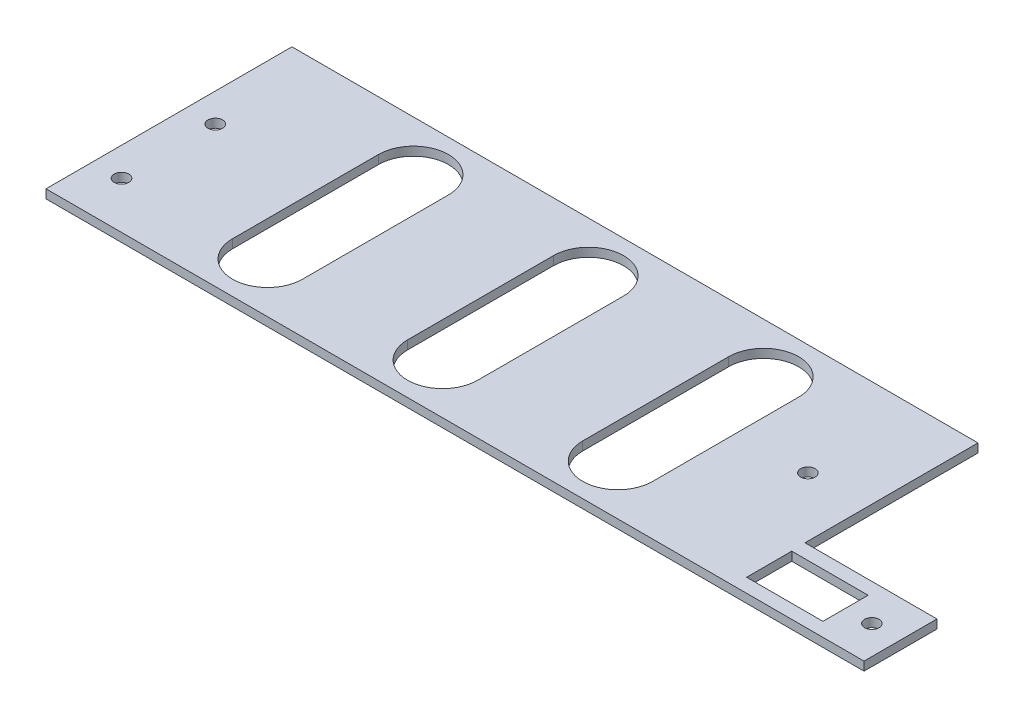
ISO-10303-21;
HEADER;
FILE_DESCRIPTION(('STEP AP214'),'2;1');
FILE_NAME('part.step','',(''),(''),'','','');
FILE_SCHEMA(('AUTOMOTIVE_DESIGN { 1 0 10303 214 1 1 1 1 }'));
ENDSEC;
DATA;
#1=APPLICATION_CONTEXT('core data for automotive mechanical design processes');
#2=APPLICATION_PROTOCOL_DEFINITION('international standard','automotive_design',2000,#1);
#3=PRODUCT_CONTEXT('',#1,'mechanical');
#4=PRODUCT('Part','Part','',(#3));
#5=PRODUCT_RELATED_PRODUCT_CATEGORY('part','',(#4));
#6=PRODUCT_DEFINITION_FORMATION('','',#4);
#7=PRODUCT_DEFINITION_CONTEXT('part definition',#1,'design');
#8=PRODUCT_DEFINITION('design','',#6,#7);
#9=PRODUCT_DEFINITION_SHAPE('','',#8);
#10=(LENGTH_UNIT() NAMED_UNIT(*) SI_UNIT(.MILLI.,.METRE.));
#11=(NAMED_UNIT(*) PLANE_ANGLE_UNIT() SI_UNIT($,.RADIAN.));
#12=(NAMED_UNIT(*) SI_UNIT($,.STERADIAN.) SOLID_ANGLE_UNIT());
#13=UNCERTAINTY_MEASURE_WITH_UNIT(LENGTH_MEASURE(1.E-05),#10,'distance_accuracy_value','');
#14=(GEOMETRIC_REPRESENTATION_CONTEXT(3) GLOBAL_UNCERTAINTY_ASSIGNED_CONTEXT((#13)) GLOBAL_UNIT_ASSIGNED_CONTEXT((#10,
#11,#12)) REPRESENTATION_CONTEXT('',''));
#15=CARTESIAN_POINT('',(0.,0.,0.));
#16=DIRECTION('',(0.,0.,1.));
#17=DIRECTION('',(1.,0.,0.));
#18=AXIS2_PLACEMENT_3D('',#15,#16,#17);
#19=CARTESIAN_POINT('',(0.,3.,0.));
#20=DIRECTION('',(0.,-1.,0.));
#21=DIRECTION('',(0.,0.,-1.));
#22=AXIS2_PLACEMENT_3D('',#19,#20,#21);
#23=PLANE('',#22);
#24=CARTESIAN_POINT('',(-160.228456395074,3.,-12.702500000165));
#25=DIRECTION('',(0.,1.,0.));
#26=DIRECTION('',(0.,0.,1.));
#27=AXIS2_PLACEMENT_3D('',#24,#25,#26);
#28=CIRCLE('',#27,2.5);
#29=CARTESIAN_POINT('',(-160.228456395074,3.,-10.202500000165));
#30=VERTEX_POINT('',#29);
#31=EDGE_CURVE('E419',#30,#30,#28,.T.);
#32=ORIENTED_EDGE('',*,*,#31,.F.);
#33=EDGE_LOOP('',(#32));
#34=FACE_BOUND('',#33,.T.);
#35=CARTESIAN_POINT('',(100.471543604893,3.,22.999999999835));
#36=DIRECTION('',(0.,1.,0.));
#37=DIRECTION('',(0.,0.,1.));
#38=AXIS2_PLACEMENT_3D('',#35,#36,#37);
#39=CIRCLE('',#38,2.50000000000001);
#40=CARTESIAN_POINT('',(100.471543604893,3.,25.499999999835));
#41=VERTEX_POINT('',#40);
#42=EDGE_CURVE('E427',#41,#41,#39,.T.);
#43=ORIENTED_EDGE('',*,*,#42,.F.);
#44=EDGE_LOOP('',(#43));
#45=FACE_BOUND('',#44,.T.);
#46=CARTESIAN_POINT('',(-160.228456395074,3.,19.432499999835));
#47=DIRECTION('',(0.,1.,0.));
#48=DIRECTION('',(0.,0.,1.));
#49=AXIS2_PLACEMENT_3D('',#46,#47,#48);
#50=CIRCLE('',#49,2.5);
#51=CARTESIAN_POINT('',(-160.228456395074,3.,21.932499999835));
#52=VERTEX_POINT('',#51);
#53=EDGE_CURVE('E435',#52,#52,#50,.T.);
#54=ORIENTED_EDGE('',*,*,#53,.F.);
#55=EDGE_LOOP('',(#54));
#56=FACE_BOUND('',#55,.T.);
#57=CARTESIAN_POINT('',(44.8077870152855,3.,-10.7474999224714));
#58=DIRECTION('',(0.,1.,0.));
#59=DIRECTION('',(0.,0.,1.));
#60=AXIS2_PLACEMENT_3D('',#57,#58,#59);
#61=CIRCLE('',#60,2.5);
#62=CARTESIAN_POINT('',(44.8077870152855,3.,-8.24749992247143));
#63=VERTEX_POINT('',#62);
#64=EDGE_CURVE('E443',#63,#63,#61,.T.);
#65=ORIENTED_EDGE('',*,*,#64,.F.);
#66=EDGE_LOOP('',(#65));
#67=FACE_BOUND('',#66,.T.);
#68=DIRECTION('',(0.,0.,-1.));
#69=VECTOR('',#68,1.);
#70=CARTESIAN_POINT('',(65.0577870152646,3.,-28.770000000034));
#71=LINE('',#70,#69);
#72=CARTESIAN_POINT('',(65.0577870152646,3.,10.4999999999663));
#73=VERTEX_POINT('',#72);
#74=CARTESIAN_POINT('',(65.0577870152855,3.,-48.770000000034));
#75=VERTEX_POINT('',#74);
#76=EDGE_CURVE('E464',#73,#75,#71,.T.);
#77=ORIENTED_EDGE('',*,*,#76,.T.);
#78=DIRECTION('',(1.,0.,3.51525277488627E-13));
#79=VECTOR('',#78,1.);
#80=CARTESIAN_POINT('',(-170.028456395067,3.,-48.7700000001167));
#81=LINE('',#80,#79);
#82=CARTESIAN_POINT('',(-170.028456395067,3.,-48.7700000001167));
#83=VERTEX_POINT('',#82);
#84=EDGE_CURVE('E401',#83,#75,#81,.T.);
#85=ORIENTED_EDGE('',*,*,#84,.F.);
#86=DIRECTION('',(0.,0.,1.));
#87=VECTOR('',#86,1.);
#88=CARTESIAN_POINT('',(-170.028456395074,3.,-28.7700000001166));
#89=LINE('',#88,#87);
#90=CARTESIAN_POINT('',(-170.028456395074,3.,35.4999999998353));
#91=VERTEX_POINT('',#90);
#92=EDGE_CURVE('E451',#83,#91,#89,.T.);
#93=ORIENTED_EDGE('',*,*,#92,.T.);
#94=DIRECTION('',(1.,0.,0.));
#95=VECTOR('',#94,1.);
#96=CARTESIAN_POINT('',(-170.028456395074,3.,35.4999999998353));
#97=LINE('',#96,#95);
#98=CARTESIAN_POINT('',(110.271543604893,3.,35.4999999998353));
#99=VERTEX_POINT('',#98);
#100=EDGE_CURVE('E454',#91,#99,#97,.T.);
#101=ORIENTED_EDGE('',*,*,#100,.T.);
#102=DIRECTION('',(0.,0.,-1.));
#103=VECTOR('',#102,1.);
#104=CARTESIAN_POINT('',(110.271543604893,3.,10.4999999998353));
#105=LINE('',#104,#103);
#106=CARTESIAN_POINT('',(110.271543604893,3.,10.4999999998353));
#107=VERTEX_POINT('',#106);
#108=EDGE_CURVE('E458',#99,#107,#105,.T.);
#109=ORIENTED_EDGE('',*,*,#108,.T.);
#110=DIRECTION('',(-1.,0.,2.89618351105165E-12));
#111=VECTOR('',#110,1.);
#112=CARTESIAN_POINT('',(65.0577870152646,3.,10.4999999999663));
#113=LINE('',#112,#111);
#114=EDGE_CURVE('E461',#107,#73,#113,.T.);
#115=ORIENTED_EDGE('',*,*,#114,.T.);
#116=EDGE_LOOP('',(#77,#85,#93,#101,#109,#115));
#117=FACE_BOUND('',#116,.T.);
#118=DIRECTION('',(0.,0.,1.));
#119=VECTOR('',#118,1.);
#120=CARTESIAN_POINT('',(20.7431044575103,3.,0.));
#121=LINE('',#120,#119);
#122=CARTESIAN_POINT('',(20.7431044575103,3.,-31.6350000001398));
#123=VERTEX_POINT('',#122);
#124=CARTESIAN_POINT('',(20.7431044575103,3.,18.3649999998602));
#125=VERTEX_POINT('',#124);
#126=EDGE_CURVE('E357',#123,#125,#121,.T.);
#127=ORIENTED_EDGE('',*,*,#126,.T.);
#128=CARTESIAN_POINT('',(8.74310445751027,3.,18.3649999998602));
#129=DIRECTION('',(0.,-1.,0.));
#130=DIRECTION('',(0.,0.,-1.));
#131=AXIS2_PLACEMENT_3D('',#128,#129,#130);
#132=CIRCLE('',#131,12.);
#133=CARTESIAN_POINT('',(-3.25689554248973,3.,18.3649999998602));
#134=VERTEX_POINT('',#133);
#135=EDGE_CURVE('E361',#125,#134,#132,.T.);
#136=ORIENTED_EDGE('',*,*,#135,.T.);
#137=DIRECTION('',(0.,0.,-1.));
#138=VECTOR('',#137,1.);
#139=CARTESIAN_POINT('',(-3.25689554248973,3.,0.));
#140=LINE('',#139,#138);
#141=CARTESIAN_POINT('',(-3.25689554248973,3.,-31.6350000001398));
#142=VERTEX_POINT('',#141);
#143=EDGE_CURVE('E290',#134,#142,#140,.T.);
#144=ORIENTED_EDGE('',*,*,#143,.T.);
#145=CARTESIAN_POINT('',(8.74310445751027,3.,-31.6350000001398));
#146=DIRECTION('',(0.,-1.,0.));
#147=DIRECTION('',(0.,0.,-1.));
#148=AXIS2_PLACEMENT_3D('',#145,#146,#147);
#149=CIRCLE('',#148,12.);
#150=EDGE_CURVE('E353',#142,#123,#149,.T.);
#151=ORIENTED_EDGE('',*,*,#150,.T.);
#152=EDGE_LOOP('',(#127,#136,#144,#151));
#153=FACE_BOUND('',#152,.T.);
#154=DIRECTION('',(0.,0.,1.));
#155=VECTOR('',#154,1.);
#156=CARTESIAN_POINT('',(-39.2568955424897,3.,0.));
#157=LINE('',#156,#155);
#158=CARTESIAN_POINT('',(-39.2568955424897,3.,-31.6350000001403));
#159=VERTEX_POINT('',#158);
#160=CARTESIAN_POINT('',(-39.2568955424897,3.,18.3649999998597));
#161=VERTEX_POINT('',#160);
#162=EDGE_CURVE('E373',#159,#161,#157,.T.);
#163=ORIENTED_EDGE('',*,*,#162,.T.);
#164=CARTESIAN_POINT('',(-51.2568955424897,3.,18.3649999998597));
#165=DIRECTION('',(0.,-1.,0.));
#166=DIRECTION('',(0.,0.,-1.));
#167=AXIS2_PLACEMENT_3D('',#164,#165,#166);
#168=CIRCLE('',#167,12.);
#169=CARTESIAN_POINT('',(-63.2568955424897,3.,18.3649999998597));
#170=VERTEX_POINT('',#169);
#171=EDGE_CURVE('E377',#161,#170,#168,.T.);
#172=ORIENTED_EDGE('',*,*,#171,.T.);
#173=DIRECTION('',(0.,0.,-1.));
#174=VECTOR('',#173,1.);
#175=CARTESIAN_POINT('',(-63.2568955424897,3.,0.));
#176=LINE('',#175,#174);
#177=CARTESIAN_POINT('',(-63.2568955424897,3.,-31.6350000001403));
#178=VERTEX_POINT('',#177);
#179=EDGE_CURVE('E365',#170,#178,#176,.T.);
#180=ORIENTED_EDGE('',*,*,#179,.T.);
#181=CARTESIAN_POINT('',(-51.2568955424897,3.,-31.6350000001403));
#182=DIRECTION('',(0.,-1.,0.));
#183=DIRECTION('',(0.,0.,-1.));
#184=AXIS2_PLACEMENT_3D('',#181,#182,#183);
#185=CIRCLE('',#184,12.);
#186=EDGE_CURVE('E369',#178,#159,#185,.T.);
#187=ORIENTED_EDGE('',*,*,#186,.T.);
#188=EDGE_LOOP('',(#163,#172,#180,#187));
#189=FACE_BOUND('',#188,.T.);
#190=DIRECTION('',(0.,0.,1.));
#191=VECTOR('',#190,1.);
#192=CARTESIAN_POINT('',(-99.2568955424897,3.,0.));
#193=LINE('',#192,#191);
#194=CARTESIAN_POINT('',(-99.2568955424897,3.,-31.6350000001407));
#195=VERTEX_POINT('',#194);
#196=CARTESIAN_POINT('',(-99.2568955424897,3.,18.3649999998593));
#197=VERTEX_POINT('',#196);
#198=EDGE_CURVE('E389',#195,#197,#193,.T.);
#199=ORIENTED_EDGE('',*,*,#198,.T.);
#200=CARTESIAN_POINT('',(-111.25689554249,3.,18.3649999998593));
#201=DIRECTION('',(0.,-1.,0.));
#202=DIRECTION('',(0.,0.,-1.));
#203=AXIS2_PLACEMENT_3D('',#200,#201,#202);
#204=CIRCLE('',#203,12.);
#205=CARTESIAN_POINT('',(-123.25689554249,3.,18.3649999998593));
#206=VERTEX_POINT('',#205);
#207=EDGE_CURVE('E393',#197,#206,#204,.T.);
#208=ORIENTED_EDGE('',*,*,#207,.T.);
#209=DIRECTION('',(0.,0.,-1.));
#210=VECTOR('',#209,1.);
#211=CARTESIAN_POINT('',(-123.25689554249,3.,0.));
#212=LINE('',#211,#210);
#213=CARTESIAN_POINT('',(-123.25689554249,3.,-31.6350000001407));
#214=VERTEX_POINT('',#213);
#215=EDGE_CURVE('E381',#206,#214,#212,.T.);
#216=ORIENTED_EDGE('',*,*,#215,.T.);
#217=CARTESIAN_POINT('',(-111.25689554249,3.,-31.6350000001407));
#218=DIRECTION('',(0.,-1.,0.));
#219=DIRECTION('',(0.,0.,-1.));
#220=AXIS2_PLACEMENT_3D('',#217,#218,#219);
#221=CIRCLE('',#220,12.);
#222=EDGE_CURVE('E385',#214,#195,#221,.T.);
#223=ORIENTED_EDGE('',*,*,#222,.T.);
#224=EDGE_LOOP('',(#199,#208,#216,#223));
#225=FACE_BOUND('',#224,.T.);
#226=DIRECTION('',(1.,0.,0.));
#227=VECTOR('',#226,1.);
#228=CARTESIAN_POINT('',(0.,3.,30.7405788799358));
#229=LINE('',#228,#227);
#230=CARTESIAN_POINT('',(65.2715436048932,3.,30.7405788799358));
#231=VERTEX_POINT('',#230);
#232=CARTESIAN_POINT('',(91.4365403814988,3.,30.7405788799358));
#233=VERTEX_POINT('',#232);
#234=EDGE_CURVE('E241',#231,#233,#229,.T.);
#235=ORIENTED_EDGE('',*,*,#234,.F.);
#236=DIRECTION('',(0.,0.,1.));
#237=VECTOR('',#236,1.);
#238=CARTESIAN_POINT('',(65.2715436048932,3.,17.999999999835));
#239=LINE('',#238,#237);
#240=CARTESIAN_POINT('',(65.2715436048932,3.,15.2594211197342));
#241=VERTEX_POINT('',#240);
#242=EDGE_CURVE('E253',#241,#231,#239,.T.);
#243=ORIENTED_EDGE('',*,*,#242,.F.);
#244=DIRECTION('',(1.,0.,0.));
#245=VECTOR('',#244,1.);
#246=CARTESIAN_POINT('',(0.,3.,15.2594211197342));
#247=LINE('',#246,#245);
#248=CARTESIAN_POINT('',(91.4365403814988,3.,15.2594211197342));
#249=VERTEX_POINT('',#248);
#250=EDGE_CURVE('E234',#241,#249,#247,.T.);
#251=ORIENTED_EDGE('',*,*,#250,.T.);
#252=DIRECTION('',(0.,0.,1.));
#253=VECTOR('',#252,1.);
#254=CARTESIAN_POINT('',(91.4365403814988,3.,0.));
#255=LINE('',#254,#253);
#256=EDGE_CURVE('E244',#249,#233,#255,.T.);
#257=ORIENTED_EDGE('',*,*,#256,.T.);
#258=EDGE_LOOP('',(#235,#243,#251,#257));
#259=FACE_BOUND('',#258,.T.);
#260=ADVANCED_FACE('F38',(#34,#45,#56,#67,#117,#153,#189,#225,#259),#23,.F.);
#261=CARTESIAN_POINT('',(0.,0.,0.));
#262=DIRECTION('',(0.,-1.,0.));
#263=DIRECTION('',(0.,0.,-1.));
#264=AXIS2_PLACEMENT_3D('',#261,#262,#263);
#265=PLANE('',#264);
#266=CARTESIAN_POINT('',(-111.25689554249,0.,18.3649999998593));
#267=DIRECTION('',(0.,-1.,0.));
#268=DIRECTION('',(0.,0.,-1.));
#269=AXIS2_PLACEMENT_3D('',#266,#267,#268);
#270=CIRCLE('',#269,12.);
#271=CARTESIAN_POINT('',(-99.2568955424897,0.,18.3649999998593));
#272=VERTEX_POINT('',#271);
#273=CARTESIAN_POINT('',(-123.25689554249,0.,18.3649999998593));
#274=VERTEX_POINT('',#273);
#275=EDGE_CURVE('E271',#272,#274,#270,.T.);
#276=ORIENTED_EDGE('',*,*,#275,.F.);
#277=DIRECTION('',(0.,0.,1.));
#278=VECTOR('',#277,1.);
#279=CARTESIAN_POINT('',(-99.2568955424897,0.,18.3649999998593));
#280=LINE('',#279,#278);
#281=CARTESIAN_POINT('',(-99.2568955424897,0.,-31.6350000001407));
#282=VERTEX_POINT('',#281);
#283=EDGE_CURVE('E282',#282,#272,#280,.T.);
#284=ORIENTED_EDGE('',*,*,#283,.F.);
#285=CARTESIAN_POINT('',(-111.25689554249,0.,-31.6350000001407));
#286=DIRECTION('',(0.,-1.,0.));
#287=DIRECTION('',(0.,0.,-1.));
#288=AXIS2_PLACEMENT_3D('',#285,#286,#287);
#289=CIRCLE('',#288,12.);
#290=CARTESIAN_POINT('',(-123.25689554249,0.,-31.6350000001407));
#291=VERTEX_POINT('',#290);
#292=EDGE_CURVE('E278',#291,#282,#289,.T.);
#293=ORIENTED_EDGE('',*,*,#292,.F.);
#294=DIRECTION('',(0.,0.,-1.));
#295=VECTOR('',#294,1.);
#296=CARTESIAN_POINT('',(-123.25689554249,0.,18.3649999998593));
#297=LINE('',#296,#295);
#298=EDGE_CURVE('E274',#274,#291,#297,.T.);
#299=ORIENTED_EDGE('',*,*,#298,.F.);
#300=EDGE_LOOP('',(#276,#284,#293,#299));
#301=FACE_BOUND('',#300,.T.);
#302=CARTESIAN_POINT('',(-51.2568955424897,0.,18.3649999998597));
#303=DIRECTION('',(0.,-1.,0.));
#304=DIRECTION('',(0.,0.,-1.));
#305=AXIS2_PLACEMENT_3D('',#302,#303,#304);
#306=CIRCLE('',#305,12.);
#307=CARTESIAN_POINT('',(-39.2568955424897,0.,18.3649999998597));
#308=VERTEX_POINT('',#307);
#309=CARTESIAN_POINT('',(-63.2568955424897,0.,18.3649999998597));
#310=VERTEX_POINT('',#309);
#311=EDGE_CURVE('E299',#308,#310,#306,.T.);
#312=ORIENTED_EDGE('',*,*,#311,.F.);
#313=DIRECTION('',(0.,0.,1.));
#314=VECTOR('',#313,1.);
#315=CARTESIAN_POINT('',(-39.2568955424897,0.,18.3649999998597));
#316=LINE('',#315,#314);
#317=CARTESIAN_POINT('',(-39.2568955424897,0.,-31.6350000001403));
#318=VERTEX_POINT('',#317);
#319=EDGE_CURVE('E310',#318,#308,#316,.T.);
#320=ORIENTED_EDGE('',*,*,#319,.F.);
#321=CARTESIAN_POINT('',(-51.2568955424897,0.,-31.6350000001403));
#322=DIRECTION('',(0.,-1.,0.));
#323=DIRECTION('',(0.,0.,-1.));
#324=AXIS2_PLACEMENT_3D('',#321,#322,#323);
#325=CIRCLE('',#324,12.);
#326=CARTESIAN_POINT('',(-63.2568955424897,0.,-31.6350000001403));
#327=VERTEX_POINT('',#326);
#328=EDGE_CURVE('E306',#327,#318,#325,.T.);
#329=ORIENTED_EDGE('',*,*,#328,.F.);
#330=DIRECTION('',(0.,0.,-1.));
#331=VECTOR('',#330,1.);
#332=CARTESIAN_POINT('',(-63.2568955424897,0.,18.3649999998597));
#333=LINE('',#332,#331);
#334=EDGE_CURVE('E302',#310,#327,#333,.T.);
#335=ORIENTED_EDGE('',*,*,#334,.F.);
#336=EDGE_LOOP('',(#312,#320,#329,#335));
#337=FACE_BOUND('',#336,.T.);
#338=CARTESIAN_POINT('',(8.74310445751027,0.,18.3649999998602));
#339=DIRECTION('',(0.,-1.,0.));
#340=DIRECTION('',(0.,0.,-1.));
#341=AXIS2_PLACEMENT_3D('',#338,#339,#340);
#342=CIRCLE('',#341,12.);
#343=CARTESIAN_POINT('',(20.7431044575103,0.,18.3649999998602));
#344=VERTEX_POINT('',#343);
#345=CARTESIAN_POINT('',(-3.25689554248973,0.,18.3649999998602));
#346=VERTEX_POINT('',#345);
#347=EDGE_CURVE('E264',#344,#346,#342,.T.);
#348=ORIENTED_EDGE('',*,*,#347,.F.);
#349=DIRECTION('',(0.,0.,1.));
#350=VECTOR('',#349,1.);
#351=CARTESIAN_POINT('',(20.7431044575103,0.,18.3649999998602));
#352=LINE('',#351,#350);
#353=CARTESIAN_POINT('',(20.7431044575103,0.,-31.6350000001398));
#354=VERTEX_POINT('',#353);
#355=EDGE_CURVE('E334',#354,#344,#352,.T.);
#356=ORIENTED_EDGE('',*,*,#355,.F.);
#357=CARTESIAN_POINT('',(8.74310445751027,0.,-31.6350000001398));
#358=DIRECTION('',(0.,-1.,0.));
#359=DIRECTION('',(0.,0.,-1.));
#360=AXIS2_PLACEMENT_3D('',#357,#358,#359);
#361=CIRCLE('',#360,12.);
#362=CARTESIAN_POINT('',(-3.25689554248973,0.,-31.6350000001398));
#363=VERTEX_POINT('',#362);
#364=EDGE_CURVE('E330',#363,#354,#361,.T.);
#365=ORIENTED_EDGE('',*,*,#364,.F.);
#366=DIRECTION('',(0.,0.,-1.));
#367=VECTOR('',#366,1.);
#368=CARTESIAN_POINT('',(-3.25689554248973,0.,18.3649999998602));
#369=LINE('',#368,#367);
#370=EDGE_CURVE('E326',#346,#363,#369,.T.);
#371=ORIENTED_EDGE('',*,*,#370,.F.);
#372=EDGE_LOOP('',(#348,#356,#365,#371));
#373=FACE_BOUND('',#372,.T.);
#374=CARTESIAN_POINT('',(100.471543604893,0.,22.999999999835));
#375=DIRECTION('',(0.,1.,0.));
#376=DIRECTION('',(0.,0.,1.));
#377=AXIS2_PLACEMENT_3D('',#374,#375,#376);
#378=CIRCLE('',#377,2.50000000000001);
#379=CARTESIAN_POINT('',(100.471543604893,0.,25.499999999835));
#380=VERTEX_POINT('',#379);
#381=EDGE_CURVE('E423',#380,#380,#378,.T.);
#382=ORIENTED_EDGE('',*,*,#381,.T.);
#383=EDGE_LOOP('',(#382));
#384=FACE_BOUND('',#383,.T.);
#385=CARTESIAN_POINT('',(44.8077870152855,0.,-10.7474999224714));
#386=DIRECTION('',(0.,1.,0.));
#387=DIRECTION('',(0.,0.,1.));
#388=AXIS2_PLACEMENT_3D('',#385,#386,#387);
#389=CIRCLE('',#388,2.5);
#390=CARTESIAN_POINT('',(44.8077870152855,0.,-8.24749992247143));
#391=VERTEX_POINT('',#390);
#392=EDGE_CURVE('E439',#391,#391,#389,.T.);
#393=ORIENTED_EDGE('',*,*,#392,.T.);
#394=EDGE_LOOP('',(#393));
#395=FACE_BOUND('',#394,.T.);
#396=DIRECTION('',(0.,0.,1.));
#397=VECTOR('',#396,1.);
#398=CARTESIAN_POINT('',(-170.028456395074,0.,22.9999999998351));
#399=LINE('',#398,#397);
#400=CARTESIAN_POINT('',(-170.028456395067,0.,-48.7700000001167));
#401=VERTEX_POINT('',#400);
#402=CARTESIAN_POINT('',(-170.028456395074,0.,35.4999999998353));
#403=VERTEX_POINT('',#402);
#404=EDGE_CURVE('E447',#401,#403,#399,.T.);
#405=ORIENTED_EDGE('',*,*,#404,.F.);
#406=DIRECTION('',(-1.,0.,-3.51525277488627E-13));
#407=VECTOR('',#406,1.);
#408=CARTESIAN_POINT('',(-170.028456395067,0.,-48.7700000001167));
#409=LINE('',#408,#407);
#410=CARTESIAN_POINT('',(65.0577870152855,0.,-48.770000000034));
#411=VERTEX_POINT('',#410);
#412=EDGE_CURVE('E409',#411,#401,#409,.T.);
#413=ORIENTED_EDGE('',*,*,#412,.F.);
#414=DIRECTION('',(0.,0.,-1.));
#415=VECTOR('',#414,1.);
#416=CARTESIAN_POINT('',(65.0577870152646,0.,-28.770000000034));
#417=LINE('',#416,#415);
#418=CARTESIAN_POINT('',(65.0577870152646,0.,10.4999999999663));
#419=VERTEX_POINT('',#418);
#420=EDGE_CURVE('E455',#419,#411,#417,.T.);
#421=ORIENTED_EDGE('',*,*,#420,.F.);
#422=DIRECTION('',(-1.,0.,2.89618351105165E-12));
#423=VECTOR('',#422,1.);
#424=CARTESIAN_POINT('',(65.0577870152646,0.,10.4999999999663));
#425=LINE('',#424,#423);
#426=CARTESIAN_POINT('',(110.271543604893,0.,10.4999999998353));
#427=VERTEX_POINT('',#426);
#428=EDGE_CURVE('E476',#427,#419,#425,.T.);
#429=ORIENTED_EDGE('',*,*,#428,.F.);
#430=DIRECTION('',(0.,0.,-1.));
#431=VECTOR('',#430,1.);
#432=CARTESIAN_POINT('',(110.271543604893,0.,10.4999999998353));
#433=LINE('',#432,#431);
#434=CARTESIAN_POINT('',(110.271543604893,0.,35.4999999998353));
#435=VERTEX_POINT('',#434);
#436=EDGE_CURVE('E473',#435,#427,#433,.T.);
#437=ORIENTED_EDGE('',*,*,#436,.F.);
#438=DIRECTION('',(1.,0.,0.));
#439=VECTOR('',#438,1.);
#440=CARTESIAN_POINT('',(-170.028456395074,0.,35.4999999998353));
#441=LINE('',#440,#439);
#442=EDGE_CURVE('E470',#403,#435,#441,.T.);
#443=ORIENTED_EDGE('',*,*,#442,.F.);
#444=EDGE_LOOP('',(#405,#413,#421,#429,#437,#443));
#445=FACE_BOUND('',#444,.T.);
#446=CARTESIAN_POINT('',(-160.228456395074,0.,19.432499999835));
#447=DIRECTION('',(0.,1.,0.));
#448=DIRECTION('',(0.,0.,1.));
#449=AXIS2_PLACEMENT_3D('',#446,#447,#448);
#450=CIRCLE('',#449,2.5);
#451=CARTESIAN_POINT('',(-160.228456395074,0.,21.932499999835));
#452=VERTEX_POINT('',#451);
#453=EDGE_CURVE('E431',#452,#452,#450,.T.);
#454=ORIENTED_EDGE('',*,*,#453,.T.);
#455=EDGE_LOOP('',(#454));
#456=FACE_BOUND('',#455,.T.);
#457=CARTESIAN_POINT('',(-160.228456395074,0.,-12.702500000165));
#458=DIRECTION('',(0.,1.,0.));
#459=DIRECTION('',(0.,0.,1.));
#460=AXIS2_PLACEMENT_3D('',#457,#458,#459);
#461=CIRCLE('',#460,2.5);
#462=CARTESIAN_POINT('',(-160.228456395074,0.,-10.202500000165));
#463=VERTEX_POINT('',#462);
#464=EDGE_CURVE('E416',#463,#463,#461,.T.);
#465=ORIENTED_EDGE('',*,*,#464,.T.);
#466=EDGE_LOOP('',(#465));
#467=FACE_BOUND('',#466,.T.);
#468=DIRECTION('',(0.,0.,1.));
#469=VECTOR('',#468,1.);
#470=CARTESIAN_POINT('',(65.2715436048932,0.,17.999999999835));
#471=LINE('',#470,#469);
#472=CARTESIAN_POINT('',(65.2715436048932,0.,15.2594211197342));
#473=VERTEX_POINT('',#472);
#474=CARTESIAN_POINT('',(65.2715436048932,0.,30.7405788799358));
#475=VERTEX_POINT('',#474);
#476=EDGE_CURVE('E413',#473,#475,#471,.T.);
#477=ORIENTED_EDGE('',*,*,#476,.T.);
#478=DIRECTION('',(-1.,0.,0.));
#479=VECTOR('',#478,1.);
#480=CARTESIAN_POINT('',(0.,0.,30.7405788799358));
#481=LINE('',#480,#479);
#482=CARTESIAN_POINT('',(91.4365403814988,0.,30.7405788799358));
#483=VERTEX_POINT('',#482);
#484=EDGE_CURVE('E11',#483,#475,#481,.T.);
#485=ORIENTED_EDGE('',*,*,#484,.F.);
#486=DIRECTION('',(0.,0.,-1.));
#487=VECTOR('',#486,1.);
#488=CARTESIAN_POINT('',(91.4365403814988,0.,0.));
#489=LINE('',#488,#487);
#490=CARTESIAN_POINT('',(91.4365403814988,0.,15.2594211197342));
#491=VERTEX_POINT('',#490);
#492=EDGE_CURVE('E47',#483,#491,#489,.T.);
#493=ORIENTED_EDGE('',*,*,#492,.T.);
#494=DIRECTION('',(-1.,0.,0.));
#495=VECTOR('',#494,1.);
#496=CARTESIAN_POINT('',(0.,0.,15.2594211197342));
#497=LINE('',#496,#495);
#498=EDGE_CURVE('E236',#491,#473,#497,.T.);
#499=ORIENTED_EDGE('',*,*,#498,.T.);
#500=EDGE_LOOP('',(#477,#485,#493,#499));
#501=FACE_BOUND('',#500,.T.);
#502=ADVANCED_FACE('F498',(#301,#337,#373,#384,#395,#445,#456,#467,#501),#265,.T.);
#503=CARTESIAN_POINT('',(-170.028456395074,3.,22.9999999998351));
#504=DIRECTION('',(1.,0.,0.));
#505=DIRECTION('',(0.,0.,-1.));
#506=AXIS2_PLACEMENT_3D('',#503,#504,#505);
#507=PLANE('',#506);
#508=ORIENTED_EDGE('',*,*,#404,.T.);
#509=DIRECTION('',(0.,-1.,0.));
#510=VECTOR('',#509,1.);
#511=CARTESIAN_POINT('',(-170.028456395074,3.,35.4999999998353));
#512=LINE('',#511,#510);
#513=EDGE_CURVE('E491',#91,#403,#512,.T.);
#514=ORIENTED_EDGE('',*,*,#513,.F.);
#515=ORIENTED_EDGE('',*,*,#92,.F.);
#516=DIRECTION('',(0.,1.,0.));
#517=VECTOR('',#516,1.);
#518=CARTESIAN_POINT('',(-170.028456395067,0.,-48.7700000001167));
#519=LINE('',#518,#517);
#520=EDGE_CURVE('E397',#401,#83,#519,.T.);
#521=ORIENTED_EDGE('',*,*,#520,.F.);
#522=EDGE_LOOP('',(#508,#514,#515,#521));
#523=FACE_BOUND('',#522,.T.);
#524=ADVANCED_FACE('F40',(#523),#507,.F.);
#525=CARTESIAN_POINT('',(-170.028456395074,3.,35.4999999998353));
#526=DIRECTION('',(0.,0.,-1.));
#527=DIRECTION('',(-1.,0.,0.));
#528=AXIS2_PLACEMENT_3D('',#525,#526,#527);
#529=PLANE('',#528);
#530=ORIENTED_EDGE('',*,*,#442,.T.);
#531=DIRECTION('',(0.,-1.,0.));
#532=VECTOR('',#531,1.);
#533=CARTESIAN_POINT('',(110.271543604893,3.,35.4999999998353));
#534=LINE('',#533,#532);
#535=EDGE_CURVE('E487',#99,#435,#534,.T.);
#536=ORIENTED_EDGE('',*,*,#535,.F.);
#537=ORIENTED_EDGE('',*,*,#100,.F.);
#538=ORIENTED_EDGE('',*,*,#513,.T.);
#539=EDGE_LOOP('',(#530,#536,#537,#538));
#540=FACE_BOUND('',#539,.T.);
#541=ADVANCED_FACE('F542',(#540),#529,.F.);
#542=CARTESIAN_POINT('',(110.271543604893,3.,10.4999999998353));
#543=DIRECTION('',(-1.,0.,0.));
#544=DIRECTION('',(0.,0.,1.));
#545=AXIS2_PLACEMENT_3D('',#542,#543,#544);
#546=PLANE('',#545);
#547=ORIENTED_EDGE('',*,*,#436,.T.);
#548=DIRECTION('',(0.,-1.,0.));
#549=VECTOR('',#548,1.);
#550=CARTESIAN_POINT('',(110.271543604893,3.,10.4999999998353));
#551=LINE('',#550,#549);
#552=EDGE_CURVE('E483',#107,#427,#551,.T.);
#553=ORIENTED_EDGE('',*,*,#552,.F.);
#554=ORIENTED_EDGE('',*,*,#108,.F.);
#555=ORIENTED_EDGE('',*,*,#535,.T.);
#556=EDGE_LOOP('',(#547,#553,#554,#555));
#557=FACE_BOUND('',#556,.T.);
#558=ADVANCED_FACE('F539',(#557),#546,.F.);
#559=CARTESIAN_POINT('',(65.0577870152646,3.,10.4999999999663));
#560=DIRECTION('',(2.89618351105165E-12,0.,1.));
#561=DIRECTION('',(1.,0.,-2.89618351105165E-12));
#562=AXIS2_PLACEMENT_3D('',#559,#560,#561);
#563=PLANE('',#562);
#564=ORIENTED_EDGE('',*,*,#428,.T.);
#565=DIRECTION('',(0.,-1.,0.));
#566=VECTOR('',#565,1.);
#567=CARTESIAN_POINT('',(65.0577870152646,3.,10.4999999999663));
#568=LINE('',#567,#566);
#569=EDGE_CURVE('E467',#73,#419,#568,.T.);
#570=ORIENTED_EDGE('',*,*,#569,.F.);
#571=ORIENTED_EDGE('',*,*,#114,.F.);
#572=ORIENTED_EDGE('',*,*,#552,.T.);
#573=EDGE_LOOP('',(#564,#570,#571,#572));
#574=FACE_BOUND('',#573,.T.);
#575=ADVANCED_FACE('F535',(#574),#563,.F.);
#576=CARTESIAN_POINT('',(65.0577870152646,3.,-28.770000000034));
#577=DIRECTION('',(-1.,0.,0.));
#578=DIRECTION('',(0.,0.,1.));
#579=AXIS2_PLACEMENT_3D('',#576,#577,#578);
#580=PLANE('',#579);
#581=ORIENTED_EDGE('',*,*,#420,.T.);
#582=DIRECTION('',(0.,-1.,0.));
#583=VECTOR('',#582,1.);
#584=CARTESIAN_POINT('',(65.0577870152855,0.,-48.770000000034));
#585=LINE('',#584,#583);
#586=EDGE_CURVE('E405',#75,#411,#585,.T.);
#587=ORIENTED_EDGE('',*,*,#586,.F.);
#588=ORIENTED_EDGE('',*,*,#76,.F.);
#589=ORIENTED_EDGE('',*,*,#569,.T.);
#590=EDGE_LOOP('',(#581,#587,#588,#589));
#591=FACE_BOUND('',#590,.T.);
#592=ADVANCED_FACE('F532',(#591),#580,.F.);
#593=CARTESIAN_POINT('',(44.8077870152855,3.,-10.7474999224714));
#594=DIRECTION('',(0.,-1.,0.));
#595=DIRECTION('',(0.,0.,-1.));
#596=AXIS2_PLACEMENT_3D('',#593,#594,#595);
#597=CYLINDRICAL_SURFACE('',#596,2.5);
#598=ORIENTED_EDGE('',*,*,#64,.T.);
#599=EDGE_LOOP('',(#598));
#600=FACE_BOUND('',#599,.T.);
#601=ORIENTED_EDGE('',*,*,#392,.F.);
#602=EDGE_LOOP('',(#601));
#603=FACE_BOUND('',#602,.T.);
#604=ADVANCED_FACE('F529',(#600,#603),#597,.F.);
#605=CARTESIAN_POINT('',(-160.228456395074,3.,19.432499999835));
#606=DIRECTION('',(0.,-1.,0.));
#607=DIRECTION('',(0.,0.,-1.));
#608=AXIS2_PLACEMENT_3D('',#605,#606,#607);
#609=CYLINDRICAL_SURFACE('',#608,2.5);
#610=ORIENTED_EDGE('',*,*,#53,.T.);
#611=EDGE_LOOP('',(#610));
#612=FACE_BOUND('',#611,.T.);
#613=ORIENTED_EDGE('',*,*,#453,.F.);
#614=EDGE_LOOP('',(#613));
#615=FACE_BOUND('',#614,.T.);
#616=ADVANCED_FACE('F645',(#612,#615),#609,.F.);
#617=CARTESIAN_POINT('',(100.471543604893,3.,22.999999999835));
#618=DIRECTION('',(0.,-1.,0.));
#619=DIRECTION('',(0.,0.,-1.));
#620=AXIS2_PLACEMENT_3D('',#617,#618,#619);
#621=CYLINDRICAL_SURFACE('',#620,2.50000000000001);
#622=ORIENTED_EDGE('',*,*,#42,.T.);
#623=EDGE_LOOP('',(#622));
#624=FACE_BOUND('',#623,.T.);
#625=ORIENTED_EDGE('',*,*,#381,.F.);
#626=EDGE_LOOP('',(#625));
#627=FACE_BOUND('',#626,.T.);
#628=ADVANCED_FACE('F515',(#624,#627),#621,.F.);
#629=CARTESIAN_POINT('',(-160.228456395074,3.,-12.702500000165));
#630=DIRECTION('',(0.,-1.,0.));
#631=DIRECTION('',(0.,0.,-1.));
#632=AXIS2_PLACEMENT_3D('',#629,#630,#631);
#633=CYLINDRICAL_SURFACE('',#632,2.5);
#634=ORIENTED_EDGE('',*,*,#31,.T.);
#635=EDGE_LOOP('',(#634));
#636=FACE_BOUND('',#635,.T.);
#637=ORIENTED_EDGE('',*,*,#464,.F.);
#638=EDGE_LOOP('',(#637));
#639=FACE_BOUND('',#638,.T.);
#640=ADVANCED_FACE('F506',(#636,#639),#633,.F.);
#641=CARTESIAN_POINT('',(65.2715436048932,0.,17.999999999835));
#642=DIRECTION('',(-1.,0.,0.));
#643=DIRECTION('',(0.,0.,1.));
#644=AXIS2_PLACEMENT_3D('',#641,#642,#643);
#645=PLANE('',#644);
#646=ORIENTED_EDGE('',*,*,#242,.T.);
#647=DIRECTION('',(0.,1.,0.));
#648=VECTOR('',#647,1.);
#649=CARTESIAN_POINT('',(65.2715436048932,-7.,30.7405788799358));
#650=LINE('',#649,#648);
#651=EDGE_CURVE('E265',#475,#231,#650,.T.);
#652=ORIENTED_EDGE('',*,*,#651,.F.);
#653=ORIENTED_EDGE('',*,*,#476,.F.);
#654=DIRECTION('',(0.,1.,0.));
#655=VECTOR('',#654,1.);
#656=CARTESIAN_POINT('',(65.2715436048932,-7.,15.2594211197342));
#657=LINE('',#656,#655);
#658=EDGE_CURVE('E240',#473,#241,#657,.T.);
#659=ORIENTED_EDGE('',*,*,#658,.T.);
#660=EDGE_LOOP('',(#646,#652,#653,#659));
#661=FACE_BOUND('',#660,.T.);
#662=ADVANCED_FACE('F503',(#661),#645,.F.);
#663=CARTESIAN_POINT('',(1.71438877831407E-11,0.,-48.7700000000569));
#664=DIRECTION('',(3.51525277488627E-13,0.,-1.));
#665=DIRECTION('',(-1.,0.,-3.51525277488627E-13));
#666=AXIS2_PLACEMENT_3D('',#663,#664,#665);
#667=PLANE('',#666);
#668=ORIENTED_EDGE('',*,*,#520,.T.);
#669=ORIENTED_EDGE('',*,*,#84,.T.);
#670=ORIENTED_EDGE('',*,*,#586,.T.);
#671=ORIENTED_EDGE('',*,*,#412,.T.);
#672=EDGE_LOOP('',(#668,#669,#670,#671));
#673=FACE_BOUND('',#672,.T.);
#674=ADVANCED_FACE('F505',(#673),#667,.T.);
#675=CARTESIAN_POINT('',(8.74310445751027,10.,18.3649999998602));
#676=DIRECTION('',(0.,-1.,0.));
#677=DIRECTION('',(0.,0.,-1.));
#678=AXIS2_PLACEMENT_3D('',#675,#676,#677);
#679=CYLINDRICAL_SURFACE('',#678,12.);
#680=DIRECTION('',(0.,-1.,0.));
#681=VECTOR('',#680,1.);
#682=CARTESIAN_POINT('',(20.7431044575103,10.,18.3649999998602));
#683=LINE('',#682,#681);
#684=EDGE_CURVE('E303',#125,#344,#683,.T.);
#685=ORIENTED_EDGE('',*,*,#684,.T.);
#686=ORIENTED_EDGE('',*,*,#347,.T.);
#687=DIRECTION('',(0.,-1.,0.));
#688=VECTOR('',#687,1.);
#689=CARTESIAN_POINT('',(-3.25689554248973,10.,18.3649999998602));
#690=LINE('',#689,#688);
#691=EDGE_CURVE('E338',#134,#346,#690,.T.);
#692=ORIENTED_EDGE('',*,*,#691,.F.);
#693=ORIENTED_EDGE('',*,*,#135,.F.);
#694=EDGE_LOOP('',(#685,#686,#692,#693));
#695=FACE_BOUND('',#694,.T.);
#696=ADVANCED_FACE('F512',(#695),#679,.F.);
#697=CARTESIAN_POINT('',(20.7431044575103,10.,18.3649999998602));
#698=DIRECTION('',(1.,0.,0.));
#699=DIRECTION('',(0.,0.,-1.));
#700=AXIS2_PLACEMENT_3D('',#697,#698,#699);
#701=PLANE('',#700);
#702=DIRECTION('',(0.,-1.,0.));
#703=VECTOR('',#702,1.);
#704=CARTESIAN_POINT('',(20.7431044575103,10.,-31.6350000001398));
#705=LINE('',#704,#703);
#706=EDGE_CURVE('E341',#123,#354,#705,.T.);
#707=ORIENTED_EDGE('',*,*,#706,.T.);
#708=ORIENTED_EDGE('',*,*,#355,.T.);
#709=ORIENTED_EDGE('',*,*,#684,.F.);
#710=ORIENTED_EDGE('',*,*,#126,.F.);
#711=EDGE_LOOP('',(#707,#708,#709,#710));
#712=FACE_BOUND('',#711,.T.);
#713=ADVANCED_FACE('F615',(#712),#701,.F.);
#714=CARTESIAN_POINT('',(8.74310445751027,10.,-31.6350000001398));
#715=DIRECTION('',(0.,-1.,0.));
#716=DIRECTION('',(0.,0.,-1.));
#717=AXIS2_PLACEMENT_3D('',#714,#715,#716);
#718=CYLINDRICAL_SURFACE('',#717,12.);
#719=DIRECTION('',(0.,-1.,0.));
#720=VECTOR('',#719,1.);
#721=CARTESIAN_POINT('',(-3.25689554248973,10.,-31.6350000001398));
#722=LINE('',#721,#720);
#723=EDGE_CURVE('E344',#142,#363,#722,.T.);
#724=ORIENTED_EDGE('',*,*,#723,.T.);
#725=ORIENTED_EDGE('',*,*,#364,.T.);
#726=ORIENTED_EDGE('',*,*,#706,.F.);
#727=ORIENTED_EDGE('',*,*,#150,.F.);
#728=EDGE_LOOP('',(#724,#725,#726,#727));
#729=FACE_BOUND('',#728,.T.);
#730=ADVANCED_FACE('F618',(#729),#718,.F.);
#731=CARTESIAN_POINT('',(-3.25689554248973,10.,18.3649999998602));
#732=DIRECTION('',(-1.,0.,0.));
#733=DIRECTION('',(0.,0.,1.));
#734=AXIS2_PLACEMENT_3D('',#731,#732,#733);
#735=PLANE('',#734);
#736=ORIENTED_EDGE('',*,*,#691,.T.);
#737=ORIENTED_EDGE('',*,*,#370,.T.);
#738=ORIENTED_EDGE('',*,*,#723,.F.);
#739=ORIENTED_EDGE('',*,*,#143,.F.);
#740=EDGE_LOOP('',(#736,#737,#738,#739));
#741=FACE_BOUND('',#740,.T.);
#742=ADVANCED_FACE('F613',(#741),#735,.F.);
#743=CARTESIAN_POINT('',(-51.2568955424897,10.,18.3649999998597));
#744=DIRECTION('',(0.,-1.,0.));
#745=DIRECTION('',(0.,0.,-1.));
#746=AXIS2_PLACEMENT_3D('',#743,#744,#745);
#747=CYLINDRICAL_SURFACE('',#746,12.);
#748=DIRECTION('',(0.,-1.,0.));
#749=VECTOR('',#748,1.);
#750=CARTESIAN_POINT('',(-39.2568955424897,10.,18.3649999998597));
#751=LINE('',#750,#749);
#752=EDGE_CURVE('E275',#161,#308,#751,.T.);
#753=ORIENTED_EDGE('',*,*,#752,.T.);
#754=ORIENTED_EDGE('',*,*,#311,.T.);
#755=DIRECTION('',(0.,-1.,0.));
#756=VECTOR('',#755,1.);
#757=CARTESIAN_POINT('',(-63.2568955424897,10.,18.3649999998597));
#758=LINE('',#757,#756);
#759=EDGE_CURVE('E314',#170,#310,#758,.T.);
#760=ORIENTED_EDGE('',*,*,#759,.F.);
#761=ORIENTED_EDGE('',*,*,#171,.F.);
#762=EDGE_LOOP('',(#753,#754,#760,#761));
#763=FACE_BOUND('',#762,.T.);
#764=ADVANCED_FACE('F604',(#763),#747,.F.);
#765=CARTESIAN_POINT('',(-39.2568955424897,10.,18.3649999998597));
#766=DIRECTION('',(1.,0.,0.));
#767=DIRECTION('',(0.,0.,-1.));
#768=AXIS2_PLACEMENT_3D('',#765,#766,#767);
#769=PLANE('',#768);
#770=DIRECTION('',(0.,-1.,0.));
#771=VECTOR('',#770,1.);
#772=CARTESIAN_POINT('',(-39.2568955424897,10.,-31.6350000001403));
#773=LINE('',#772,#771);
#774=EDGE_CURVE('E317',#159,#318,#773,.T.);
#775=ORIENTED_EDGE('',*,*,#774,.T.);
#776=ORIENTED_EDGE('',*,*,#319,.T.);
#777=ORIENTED_EDGE('',*,*,#752,.F.);
#778=ORIENTED_EDGE('',*,*,#162,.F.);
#779=EDGE_LOOP('',(#775,#776,#777,#778));
#780=FACE_BOUND('',#779,.T.);
#781=ADVANCED_FACE('F600',(#780),#769,.F.);
#782=CARTESIAN_POINT('',(-51.2568955424897,10.,-31.6350000001403));
#783=DIRECTION('',(0.,-1.,0.));
#784=DIRECTION('',(0.,0.,-1.));
#785=AXIS2_PLACEMENT_3D('',#782,#783,#784);
#786=CYLINDRICAL_SURFACE('',#785,12.);
#787=DIRECTION('',(0.,-1.,0.));
#788=VECTOR('',#787,1.);
#789=CARTESIAN_POINT('',(-63.2568955424897,10.,-31.6350000001403));
#790=LINE('',#789,#788);
#791=EDGE_CURVE('E65',#178,#327,#790,.T.);
#792=ORIENTED_EDGE('',*,*,#791,.T.);
#793=ORIENTED_EDGE('',*,*,#328,.T.);
#794=ORIENTED_EDGE('',*,*,#774,.F.);
#795=ORIENTED_EDGE('',*,*,#186,.F.);
#796=EDGE_LOOP('',(#792,#793,#794,#795));
#797=FACE_BOUND('',#796,.T.);
#798=ADVANCED_FACE('F603',(#797),#786,.F.);
#799=CARTESIAN_POINT('',(-63.2568955424897,10.,18.3649999998597));
#800=DIRECTION('',(-1.,0.,0.));
#801=DIRECTION('',(0.,0.,1.));
#802=AXIS2_PLACEMENT_3D('',#799,#800,#801);
#803=PLANE('',#802);
#804=ORIENTED_EDGE('',*,*,#759,.T.);
#805=ORIENTED_EDGE('',*,*,#334,.T.);
#806=ORIENTED_EDGE('',*,*,#791,.F.);
#807=ORIENTED_EDGE('',*,*,#179,.F.);
#808=EDGE_LOOP('',(#804,#805,#806,#807));
#809=FACE_BOUND('',#808,.T.);
#810=ADVANCED_FACE('F599',(#809),#803,.F.);
#811=CARTESIAN_POINT('',(-111.25689554249,10.,18.3649999998593));
#812=DIRECTION('',(0.,-1.,0.));
#813=DIRECTION('',(0.,0.,-1.));
#814=AXIS2_PLACEMENT_3D('',#811,#812,#813);
#815=CYLINDRICAL_SURFACE('',#814,12.);
#816=DIRECTION('',(0.,-1.,0.));
#817=VECTOR('',#816,1.);
#818=CARTESIAN_POINT('',(-99.2568955424897,10.,18.3649999998593));
#819=LINE('',#818,#817);
#820=EDGE_CURVE('E287',#197,#272,#819,.T.);
#821=ORIENTED_EDGE('',*,*,#820,.T.);
#822=ORIENTED_EDGE('',*,*,#275,.T.);
#823=DIRECTION('',(0.,-1.,0.));
#824=VECTOR('',#823,1.);
#825=CARTESIAN_POINT('',(-123.25689554249,10.,18.3649999998593));
#826=LINE('',#825,#824);
#827=EDGE_CURVE('E286',#206,#274,#826,.T.);
#828=ORIENTED_EDGE('',*,*,#827,.F.);
#829=ORIENTED_EDGE('',*,*,#207,.F.);
#830=EDGE_LOOP('',(#821,#822,#828,#829));
#831=FACE_BOUND('',#830,.T.);
#832=ADVANCED_FACE('F585',(#831),#815,.F.);
#833=CARTESIAN_POINT('',(-99.2568955424897,10.,18.3649999998593));
#834=DIRECTION('',(1.,0.,0.));
#835=DIRECTION('',(0.,0.,-1.));
#836=AXIS2_PLACEMENT_3D('',#833,#834,#835);
#837=PLANE('',#836);
#838=DIRECTION('',(0.,-1.,0.));
#839=VECTOR('',#838,1.);
#840=CARTESIAN_POINT('',(-99.2568955424897,10.,-31.6350000001407));
#841=LINE('',#840,#839);
#842=EDGE_CURVE('E291',#195,#282,#841,.T.);
#843=ORIENTED_EDGE('',*,*,#842,.T.);
#844=ORIENTED_EDGE('',*,*,#283,.T.);
#845=ORIENTED_EDGE('',*,*,#820,.F.);
#846=ORIENTED_EDGE('',*,*,#198,.F.);
#847=EDGE_LOOP('',(#843,#844,#845,#846));
#848=FACE_BOUND('',#847,.T.);
#849=ADVANCED_FACE('F575',(#848),#837,.F.);
#850=CARTESIAN_POINT('',(-111.25689554249,10.,-31.6350000001407));
#851=DIRECTION('',(0.,-1.,0.));
#852=DIRECTION('',(0.,0.,-1.));
#853=AXIS2_PLACEMENT_3D('',#850,#851,#852);
#854=CYLINDRICAL_SURFACE('',#853,12.);
#855=DIRECTION('',(0.,-1.,0.));
#856=VECTOR('',#855,1.);
#857=CARTESIAN_POINT('',(-123.25689554249,10.,-31.6350000001407));
#858=LINE('',#857,#856);
#859=EDGE_CURVE('E57',#214,#291,#858,.T.);
#860=ORIENTED_EDGE('',*,*,#859,.T.);
#861=ORIENTED_EDGE('',*,*,#292,.T.);
#862=ORIENTED_EDGE('',*,*,#842,.F.);
#863=ORIENTED_EDGE('',*,*,#222,.F.);
#864=EDGE_LOOP('',(#860,#861,#862,#863));
#865=FACE_BOUND('',#864,.T.);
#866=ADVANCED_FACE('F577',(#865),#854,.F.);
#867=CARTESIAN_POINT('',(-123.25689554249,10.,18.3649999998593));
#868=DIRECTION('',(-1.,0.,0.));
#869=DIRECTION('',(0.,0.,1.));
#870=AXIS2_PLACEMENT_3D('',#867,#868,#869);
#871=PLANE('',#870);
#872=ORIENTED_EDGE('',*,*,#827,.T.);
#873=ORIENTED_EDGE('',*,*,#298,.T.);
#874=ORIENTED_EDGE('',*,*,#859,.F.);
#875=ORIENTED_EDGE('',*,*,#215,.F.);
#876=EDGE_LOOP('',(#872,#873,#874,#875));
#877=FACE_BOUND('',#876,.T.);
#878=ADVANCED_FACE('F586',(#877),#871,.F.);
#879=CARTESIAN_POINT('',(91.4365403814988,-7.,0.));
#880=DIRECTION('',(-1.,0.,0.));
#881=DIRECTION('',(0.,0.,1.));
#882=AXIS2_PLACEMENT_3D('',#879,#880,#881);
#883=PLANE('',#882);
#884=DIRECTION('',(0.,1.,0.));
#885=VECTOR('',#884,1.);
#886=CARTESIAN_POINT('',(91.4365403814988,-7.,30.7405788799358));
#887=LINE('',#886,#885);
#888=EDGE_CURVE('E247',#483,#233,#887,.T.);
#889=ORIENTED_EDGE('',*,*,#888,.T.);
#890=ORIENTED_EDGE('',*,*,#256,.F.);
#891=DIRECTION('',(0.,1.,0.));
#892=VECTOR('',#891,1.);
#893=CARTESIAN_POINT('',(91.4365403814988,-7.,15.2594211197342));
#894=LINE('',#893,#892);
#895=EDGE_CURVE('E229',#491,#249,#894,.T.);
#896=ORIENTED_EDGE('',*,*,#895,.F.);
#897=ORIENTED_EDGE('',*,*,#492,.F.);
#898=EDGE_LOOP('',(#889,#890,#896,#897));
#899=FACE_BOUND('',#898,.T.);
#900=ADVANCED_FACE('F245',(#899),#883,.T.);
#901=CARTESIAN_POINT('',(0.,-7.,30.7405788799358));
#902=DIRECTION('',(0.,0.,1.));
#903=DIRECTION('',(1.,0.,0.));
#904=AXIS2_PLACEMENT_3D('',#901,#902,#903);
#905=PLANE('',#904);
#906=ORIENTED_EDGE('',*,*,#484,.T.);
#907=ORIENTED_EDGE('',*,*,#651,.T.);
#908=ORIENTED_EDGE('',*,*,#234,.T.);
#909=ORIENTED_EDGE('',*,*,#888,.F.);
#910=EDGE_LOOP('',(#906,#907,#908,#909));
#911=FACE_BOUND('',#910,.T.);
#912=ADVANCED_FACE('F500',(#911),#905,.F.);
#913=CARTESIAN_POINT('',(0.,-7.,15.2594211197342));
#914=DIRECTION('',(0.,0.,1.));
#915=DIRECTION('',(1.,0.,0.));
#916=AXIS2_PLACEMENT_3D('',#913,#914,#915);
#917=PLANE('',#916);
#918=ORIENTED_EDGE('',*,*,#895,.T.);
#919=ORIENTED_EDGE('',*,*,#250,.F.);
#920=ORIENTED_EDGE('',*,*,#658,.F.);
#921=ORIENTED_EDGE('',*,*,#498,.F.);
#922=EDGE_LOOP('',(#918,#919,#920,#921));
#923=FACE_BOUND('',#922,.T.);
#924=ADVANCED_FACE('F231',(#923),#917,.T.);
#925=CLOSED_SHELL('',(#260,#502,#524,#541,#558,#575,#592,#604,#616,#628,#640,#662,#674,#696,
#713,#730,#742,#764,#781,#798,#810,#832,#849,#866,#878,#900,#912,#924));
#926=MANIFOLD_SOLID_BREP('B2',#925);
#927=ADVANCED_BREP_SHAPE_REPRESENTATION('',(#18,#926),#14);
#928=SHAPE_DEFINITION_REPRESENTATION(#9,#927);
ENDSEC;
END-ISO-10303-21;
